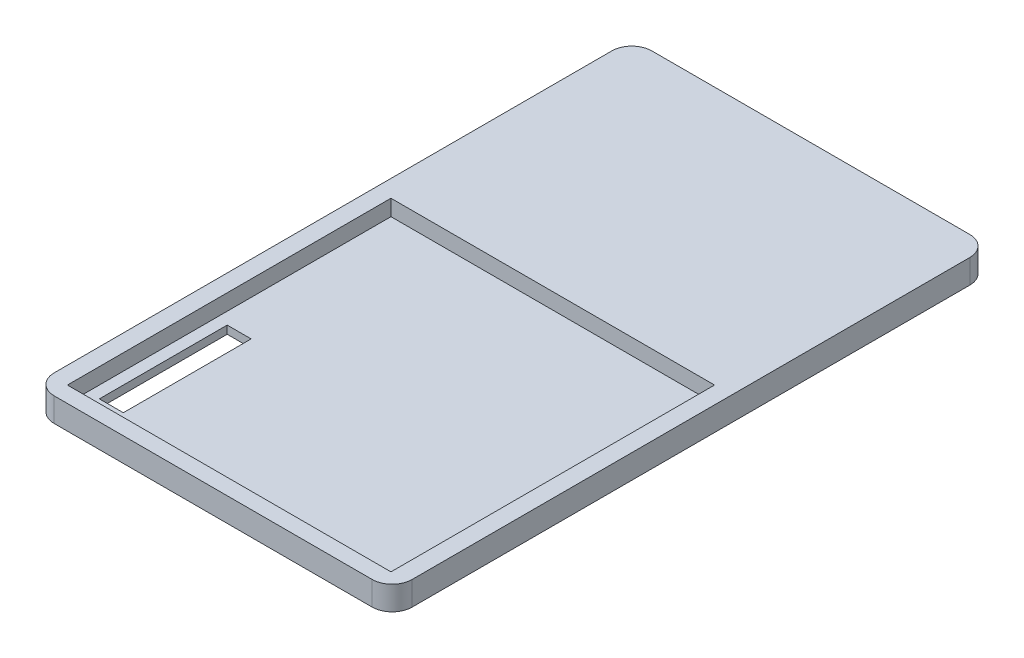
ISO-10303-21;
HEADER;
FILE_DESCRIPTION(('STEP AP214'),'2;1');
FILE_NAME('part.step','',(''),(''),'','','');
FILE_SCHEMA(('AUTOMOTIVE_DESIGN { 1 0 10303 214 1 1 1 1 }'));
ENDSEC;
DATA;
#1=APPLICATION_CONTEXT('core data for automotive mechanical design processes');
#2=APPLICATION_PROTOCOL_DEFINITION('international standard','automotive_design',2000,#1);
#3=PRODUCT_CONTEXT('',#1,'mechanical');
#4=PRODUCT('Part','Part','',(#3));
#5=PRODUCT_RELATED_PRODUCT_CATEGORY('part','',(#4));
#6=PRODUCT_DEFINITION_FORMATION('','',#4);
#7=PRODUCT_DEFINITION_CONTEXT('part definition',#1,'design');
#8=PRODUCT_DEFINITION('design','',#6,#7);
#9=PRODUCT_DEFINITION_SHAPE('','',#8);
#10=(LENGTH_UNIT() NAMED_UNIT(*) SI_UNIT(.MILLI.,.METRE.));
#11=(NAMED_UNIT(*) PLANE_ANGLE_UNIT() SI_UNIT($,.RADIAN.));
#12=(NAMED_UNIT(*) SI_UNIT($,.STERADIAN.) SOLID_ANGLE_UNIT());
#13=UNCERTAINTY_MEASURE_WITH_UNIT(LENGTH_MEASURE(1.E-05),#10,'distance_accuracy_value','');
#14=(GEOMETRIC_REPRESENTATION_CONTEXT(3) GLOBAL_UNCERTAINTY_ASSIGNED_CONTEXT((#13)) GLOBAL_UNIT_ASSIGNED_CONTEXT((#10,
#11,#12)) REPRESENTATION_CONTEXT('',''));
#15=CARTESIAN_POINT('',(0.,0.,0.));
#16=DIRECTION('',(0.,0.,1.));
#17=DIRECTION('',(1.,0.,0.));
#18=AXIS2_PLACEMENT_3D('',#15,#16,#17);
#19=CARTESIAN_POINT('',(0.,3.,-37.4));
#20=DIRECTION('',(0.,0.,-1.));
#21=DIRECTION('',(-1.,0.,0.));
#22=AXIS2_PLACEMENT_3D('',#19,#20,#21);
#23=PLANE('',#22);
#24=DIRECTION('',(1.,0.,0.));
#25=VECTOR('',#24,1.);
#26=CARTESIAN_POINT('',(0.,0.,-37.4));
#27=LINE('',#26,#25);
#28=CARTESIAN_POINT('',(-19.9,0.,-37.4));
#29=VERTEX_POINT('',#28);
#30=CARTESIAN_POINT('',(19.9,0.,-37.4));
#31=VERTEX_POINT('',#30);
#32=EDGE_CURVE('E164',#29,#31,#27,.T.);
#33=ORIENTED_EDGE('',*,*,#32,.F.);
#34=DIRECTION('',(0.,-1.,0.));
#35=VECTOR('',#34,1.);
#36=CARTESIAN_POINT('',(-19.9,3.,-37.4));
#37=LINE('',#36,#35);
#38=CARTESIAN_POINT('',(-19.9,3.,-37.4));
#39=VERTEX_POINT('',#38);
#40=EDGE_CURVE('E11',#39,#29,#37,.T.);
#41=ORIENTED_EDGE('',*,*,#40,.F.);
#42=DIRECTION('',(1.,0.,0.));
#43=VECTOR('',#42,1.);
#44=CARTESIAN_POINT('',(0.,3.,-37.4));
#45=LINE('',#44,#43);
#46=CARTESIAN_POINT('',(19.9,3.,-37.4));
#47=VERTEX_POINT('',#46);
#48=EDGE_CURVE('E218',#39,#47,#45,.T.);
#49=ORIENTED_EDGE('',*,*,#48,.T.);
#50=DIRECTION('',(0.,-1.,0.));
#51=VECTOR('',#50,1.);
#52=CARTESIAN_POINT('',(19.9,3.,-37.4));
#53=LINE('',#52,#51);
#54=EDGE_CURVE('E263',#47,#31,#53,.T.);
#55=ORIENTED_EDGE('',*,*,#54,.T.);
#56=EDGE_LOOP('',(#33,#41,#49,#55));
#57=FACE_BOUND('',#56,.T.);
#58=ADVANCED_FACE('F37',(#57),#23,.T.);
#59=CARTESIAN_POINT('',(-19.9,3.,-34.9));
#60=DIRECTION('',(0.,-1.,0.));
#61=DIRECTION('',(0.,0.,-1.));
#62=AXIS2_PLACEMENT_3D('',#59,#60,#61);
#63=CYLINDRICAL_SURFACE('',#62,2.5);
#64=CARTESIAN_POINT('',(-19.9,0.,-34.9));
#65=DIRECTION('',(0.,1.,0.));
#66=DIRECTION('',(0.,0.,1.));
#67=AXIS2_PLACEMENT_3D('',#64,#65,#66);
#68=CIRCLE('',#67,2.5);
#69=CARTESIAN_POINT('',(-22.4,0.,-34.9));
#70=VERTEX_POINT('',#69);
#71=EDGE_CURVE('E243',#29,#70,#68,.T.);
#72=ORIENTED_EDGE('',*,*,#71,.T.);
#73=DIRECTION('',(0.,-1.,0.));
#74=VECTOR('',#73,1.);
#75=CARTESIAN_POINT('',(-22.4,3.,-34.9));
#76=LINE('',#75,#74);
#77=CARTESIAN_POINT('',(-22.4,3.,-34.9));
#78=VERTEX_POINT('',#77);
#79=EDGE_CURVE('E46',#78,#70,#76,.T.);
#80=ORIENTED_EDGE('',*,*,#79,.F.);
#81=CARTESIAN_POINT('',(-19.9,3.,-34.9));
#82=DIRECTION('',(0.,1.,0.));
#83=DIRECTION('',(0.,0.,1.));
#84=AXIS2_PLACEMENT_3D('',#81,#82,#83);
#85=CIRCLE('',#84,2.5);
#86=EDGE_CURVE('E221',#39,#78,#85,.T.);
#87=ORIENTED_EDGE('',*,*,#86,.F.);
#88=ORIENTED_EDGE('',*,*,#40,.T.);
#89=EDGE_LOOP('',(#72,#80,#87,#88));
#90=FACE_BOUND('',#89,.T.);
#91=ADVANCED_FACE('F305',(#90),#63,.T.);
#92=CARTESIAN_POINT('',(-22.4,3.,0.));
#93=DIRECTION('',(1.,0.,0.));
#94=DIRECTION('',(0.,0.,-1.));
#95=AXIS2_PLACEMENT_3D('',#92,#93,#94);
#96=PLANE('',#95);
#97=DIRECTION('',(0.,0.,1.));
#98=VECTOR('',#97,1.);
#99=CARTESIAN_POINT('',(-22.4,0.,0.));
#100=LINE('',#99,#98);
#101=CARTESIAN_POINT('',(-22.4,0.,34.9));
#102=VERTEX_POINT('',#101);
#103=EDGE_CURVE('E246',#70,#102,#100,.T.);
#104=ORIENTED_EDGE('',*,*,#103,.T.);
#105=DIRECTION('',(0.,-1.,0.));
#106=VECTOR('',#105,1.);
#107=CARTESIAN_POINT('',(-22.4,3.,34.9));
#108=LINE('',#107,#106);
#109=CARTESIAN_POINT('',(-22.4,3.,34.9));
#110=VERTEX_POINT('',#109);
#111=EDGE_CURVE('E275',#110,#102,#108,.T.);
#112=ORIENTED_EDGE('',*,*,#111,.F.);
#113=DIRECTION('',(0.,0.,1.));
#114=VECTOR('',#113,1.);
#115=CARTESIAN_POINT('',(-22.4,3.,0.));
#116=LINE('',#115,#114);
#117=EDGE_CURVE('E224',#78,#110,#116,.T.);
#118=ORIENTED_EDGE('',*,*,#117,.F.);
#119=ORIENTED_EDGE('',*,*,#79,.T.);
#120=EDGE_LOOP('',(#104,#112,#118,#119));
#121=FACE_BOUND('',#120,.T.);
#122=ADVANCED_FACE('F311',(#121),#96,.F.);
#123=CARTESIAN_POINT('',(-19.9,3.,34.9));
#124=DIRECTION('',(0.,-1.,0.));
#125=DIRECTION('',(0.,0.,-1.));
#126=AXIS2_PLACEMENT_3D('',#123,#124,#125);
#127=CYLINDRICAL_SURFACE('',#126,2.5);
#128=CARTESIAN_POINT('',(-19.9,0.,34.9));
#129=DIRECTION('',(0.,1.,0.));
#130=DIRECTION('',(0.,0.,1.));
#131=AXIS2_PLACEMENT_3D('',#128,#129,#130);
#132=CIRCLE('',#131,2.5);
#133=CARTESIAN_POINT('',(-19.9,0.,37.4));
#134=VERTEX_POINT('',#133);
#135=EDGE_CURVE('E249',#102,#134,#132,.T.);
#136=ORIENTED_EDGE('',*,*,#135,.T.);
#137=DIRECTION('',(0.,-1.,0.));
#138=VECTOR('',#137,1.);
#139=CARTESIAN_POINT('',(-19.9,3.,37.4));
#140=LINE('',#139,#138);
#141=CARTESIAN_POINT('',(-19.9,3.,37.4));
#142=VERTEX_POINT('',#141);
#143=EDGE_CURVE('E272',#142,#134,#140,.T.);
#144=ORIENTED_EDGE('',*,*,#143,.F.);
#145=CARTESIAN_POINT('',(-19.9,3.,34.9));
#146=DIRECTION('',(0.,1.,0.));
#147=DIRECTION('',(0.,0.,1.));
#148=AXIS2_PLACEMENT_3D('',#145,#146,#147);
#149=CIRCLE('',#148,2.5);
#150=EDGE_CURVE('E227',#110,#142,#149,.T.);
#151=ORIENTED_EDGE('',*,*,#150,.F.);
#152=ORIENTED_EDGE('',*,*,#111,.T.);
#153=EDGE_LOOP('',(#136,#144,#151,#152));
#154=FACE_BOUND('',#153,.T.);
#155=ADVANCED_FACE('F437',(#154),#127,.T.);
#156=CARTESIAN_POINT('',(0.,3.,37.4));
#157=DIRECTION('',(0.,0.,-1.));
#158=DIRECTION('',(-1.,0.,0.));
#159=AXIS2_PLACEMENT_3D('',#156,#157,#158);
#160=PLANE('',#159);
#161=DIRECTION('',(1.,0.,0.));
#162=VECTOR('',#161,1.);
#163=CARTESIAN_POINT('',(0.,0.,37.4));
#164=LINE('',#163,#162);
#165=CARTESIAN_POINT('',(19.9,0.,37.4));
#166=VERTEX_POINT('',#165);
#167=EDGE_CURVE('E252',#134,#166,#164,.T.);
#168=ORIENTED_EDGE('',*,*,#167,.T.);
#169=DIRECTION('',(0.,-1.,0.));
#170=VECTOR('',#169,1.);
#171=CARTESIAN_POINT('',(19.9,3.,37.4));
#172=LINE('',#171,#170);
#173=CARTESIAN_POINT('',(19.9,3.,37.4));
#174=VERTEX_POINT('',#173);
#175=EDGE_CURVE('E269',#174,#166,#172,.T.);
#176=ORIENTED_EDGE('',*,*,#175,.F.);
#177=DIRECTION('',(1.,0.,0.));
#178=VECTOR('',#177,1.);
#179=CARTESIAN_POINT('',(0.,3.,37.4));
#180=LINE('',#179,#178);
#181=EDGE_CURVE('E230',#142,#174,#180,.T.);
#182=ORIENTED_EDGE('',*,*,#181,.F.);
#183=ORIENTED_EDGE('',*,*,#143,.T.);
#184=EDGE_LOOP('',(#168,#176,#182,#183));
#185=FACE_BOUND('',#184,.T.);
#186=ADVANCED_FACE('F428',(#185),#160,.F.);
#187=CARTESIAN_POINT('',(19.9,3.,34.9));
#188=DIRECTION('',(0.,-1.,0.));
#189=DIRECTION('',(0.,0.,-1.));
#190=AXIS2_PLACEMENT_3D('',#187,#188,#189);
#191=CYLINDRICAL_SURFACE('',#190,2.5);
#192=CARTESIAN_POINT('',(19.9,0.,34.9));
#193=DIRECTION('',(0.,1.,0.));
#194=DIRECTION('',(0.,0.,1.));
#195=AXIS2_PLACEMENT_3D('',#192,#193,#194);
#196=CIRCLE('',#195,2.5);
#197=CARTESIAN_POINT('',(22.4,0.,34.9));
#198=VERTEX_POINT('',#197);
#199=EDGE_CURVE('E255',#166,#198,#196,.T.);
#200=ORIENTED_EDGE('',*,*,#199,.T.);
#201=DIRECTION('',(0.,-1.,0.));
#202=VECTOR('',#201,1.);
#203=CARTESIAN_POINT('',(22.4,3.,34.9));
#204=LINE('',#203,#202);
#205=CARTESIAN_POINT('',(22.4,3.,34.9));
#206=VERTEX_POINT('',#205);
#207=EDGE_CURVE('E267',#206,#198,#204,.T.);
#208=ORIENTED_EDGE('',*,*,#207,.F.);
#209=CARTESIAN_POINT('',(19.9,3.,34.9));
#210=DIRECTION('',(0.,1.,0.));
#211=DIRECTION('',(0.,0.,1.));
#212=AXIS2_PLACEMENT_3D('',#209,#210,#211);
#213=CIRCLE('',#212,2.5);
#214=EDGE_CURVE('E233',#174,#206,#213,.T.);
#215=ORIENTED_EDGE('',*,*,#214,.F.);
#216=ORIENTED_EDGE('',*,*,#175,.T.);
#217=EDGE_LOOP('',(#200,#208,#215,#216));
#218=FACE_BOUND('',#217,.T.);
#219=ADVANCED_FACE('F301',(#218),#191,.T.);
#220=CARTESIAN_POINT('',(22.4,3.,0.));
#221=DIRECTION('',(1.,0.,0.));
#222=DIRECTION('',(0.,0.,-1.));
#223=AXIS2_PLACEMENT_3D('',#220,#221,#222);
#224=PLANE('',#223);
#225=DIRECTION('',(0.,0.,1.));
#226=VECTOR('',#225,1.);
#227=CARTESIAN_POINT('',(22.4,0.,0.));
#228=LINE('',#227,#226);
#229=CARTESIAN_POINT('',(22.4,0.,-34.9));
#230=VERTEX_POINT('',#229);
#231=EDGE_CURVE('E258',#230,#198,#228,.T.);
#232=ORIENTED_EDGE('',*,*,#231,.F.);
#233=DIRECTION('',(0.,-1.,0.));
#234=VECTOR('',#233,1.);
#235=CARTESIAN_POINT('',(22.4,3.,-34.9));
#236=LINE('',#235,#234);
#237=CARTESIAN_POINT('',(22.4,3.,-34.9));
#238=VERTEX_POINT('',#237);
#239=EDGE_CURVE('E265',#238,#230,#236,.T.);
#240=ORIENTED_EDGE('',*,*,#239,.F.);
#241=DIRECTION('',(0.,0.,1.));
#242=VECTOR('',#241,1.);
#243=CARTESIAN_POINT('',(22.4,3.,0.));
#244=LINE('',#243,#242);
#245=EDGE_CURVE('E235',#238,#206,#244,.T.);
#246=ORIENTED_EDGE('',*,*,#245,.T.);
#247=ORIENTED_EDGE('',*,*,#207,.T.);
#248=EDGE_LOOP('',(#232,#240,#246,#247));
#249=FACE_BOUND('',#248,.T.);
#250=ADVANCED_FACE('F296',(#249),#224,.T.);
#251=CARTESIAN_POINT('',(0.,3.,-5.10000000000002));
#252=DIRECTION('',(0.,0.,-1.));
#253=DIRECTION('',(-1.,0.,0.));
#254=AXIS2_PLACEMENT_3D('',#251,#252,#253);
#255=PLANE('',#254);
#256=DIRECTION('',(0.,-1.,0.));
#257=VECTOR('',#256,1.);
#258=CARTESIAN_POINT('',(-20.25,3.,-5.10000000000001));
#259=LINE('',#258,#257);
#260=CARTESIAN_POINT('',(-20.25,3.,-5.10000000000001));
#261=VERTEX_POINT('',#260);
#262=CARTESIAN_POINT('',(-20.25,1.,-5.10000000000001));
#263=VERTEX_POINT('',#262);
#264=EDGE_CURVE('E240',#261,#263,#259,.T.);
#265=ORIENTED_EDGE('',*,*,#264,.T.);
#266=DIRECTION('',(1.,0.,0.));
#267=VECTOR('',#266,1.);
#268=CARTESIAN_POINT('',(0.,1.,-5.10000000000002));
#269=LINE('',#268,#267);
#270=CARTESIAN_POINT('',(20.25,1.,-5.10000000000002));
#271=VERTEX_POINT('',#270);
#272=EDGE_CURVE('E54',#263,#271,#269,.T.);
#273=ORIENTED_EDGE('',*,*,#272,.T.);
#274=DIRECTION('',(0.,-1.,0.));
#275=VECTOR('',#274,1.);
#276=CARTESIAN_POINT('',(20.25,3.,-5.10000000000002));
#277=LINE('',#276,#275);
#278=CARTESIAN_POINT('',(20.25,3.,-5.10000000000002));
#279=VERTEX_POINT('',#278);
#280=EDGE_CURVE('E41',#279,#271,#277,.T.);
#281=ORIENTED_EDGE('',*,*,#280,.F.);
#282=DIRECTION('',(1.,0.,0.));
#283=VECTOR('',#282,1.);
#284=CARTESIAN_POINT('',(0.,3.,-5.10000000000002));
#285=LINE('',#284,#283);
#286=EDGE_CURVE('E206',#261,#279,#285,.T.);
#287=ORIENTED_EDGE('',*,*,#286,.F.);
#288=EDGE_LOOP('',(#265,#273,#281,#287));
#289=FACE_BOUND('',#288,.T.);
#290=ADVANCED_FACE('F39',(#289),#255,.F.);
#291=CARTESIAN_POINT('',(20.25,3.,0.));
#292=DIRECTION('',(1.,0.,0.));
#293=DIRECTION('',(0.,0.,-1.));
#294=AXIS2_PLACEMENT_3D('',#291,#292,#293);
#295=PLANE('',#294);
#296=ORIENTED_EDGE('',*,*,#280,.T.);
#297=DIRECTION('',(0.,0.,1.));
#298=VECTOR('',#297,1.);
#299=CARTESIAN_POINT('',(20.25,1.,0.));
#300=LINE('',#299,#298);
#301=CARTESIAN_POINT('',(20.25,1.,35.4));
#302=VERTEX_POINT('',#301);
#303=EDGE_CURVE('E61',#271,#302,#300,.T.);
#304=ORIENTED_EDGE('',*,*,#303,.T.);
#305=DIRECTION('',(0.,-1.,0.));
#306=VECTOR('',#305,1.);
#307=CARTESIAN_POINT('',(20.25,3.,35.4));
#308=LINE('',#307,#306);
#309=CARTESIAN_POINT('',(20.25,3.,35.4));
#310=VERTEX_POINT('',#309);
#311=EDGE_CURVE('E282',#310,#302,#308,.T.);
#312=ORIENTED_EDGE('',*,*,#311,.F.);
#313=DIRECTION('',(0.,0.,1.));
#314=VECTOR('',#313,1.);
#315=CARTESIAN_POINT('',(20.25,3.,0.));
#316=LINE('',#315,#314);
#317=EDGE_CURVE('E209',#279,#310,#316,.T.);
#318=ORIENTED_EDGE('',*,*,#317,.F.);
#319=EDGE_LOOP('',(#296,#304,#312,#318));
#320=FACE_BOUND('',#319,.T.);
#321=ADVANCED_FACE('F285',(#320),#295,.F.);
#322=CARTESIAN_POINT('',(0.,3.,35.4));
#323=DIRECTION('',(0.,0.,-1.));
#324=DIRECTION('',(-1.,0.,0.));
#325=AXIS2_PLACEMENT_3D('',#322,#323,#324);
#326=PLANE('',#325);
#327=DIRECTION('',(1.,0.,0.));
#328=VECTOR('',#327,1.);
#329=CARTESIAN_POINT('',(0.,1.,35.4));
#330=LINE('',#329,#328);
#331=CARTESIAN_POINT('',(-20.25,1.,35.4));
#332=VERTEX_POINT('',#331);
#333=EDGE_CURVE('E190',#332,#302,#330,.T.);
#334=ORIENTED_EDGE('',*,*,#333,.F.);
#335=DIRECTION('',(0.,-1.,0.));
#336=VECTOR('',#335,1.);
#337=CARTESIAN_POINT('',(-20.25,3.,35.4));
#338=LINE('',#337,#336);
#339=CARTESIAN_POINT('',(-20.25,3.,35.4));
#340=VERTEX_POINT('',#339);
#341=EDGE_CURVE('E281',#340,#332,#338,.T.);
#342=ORIENTED_EDGE('',*,*,#341,.F.);
#343=DIRECTION('',(1.,0.,0.));
#344=VECTOR('',#343,1.);
#345=CARTESIAN_POINT('',(0.,3.,35.4));
#346=LINE('',#345,#344);
#347=EDGE_CURVE('E212',#340,#310,#346,.T.);
#348=ORIENTED_EDGE('',*,*,#347,.T.);
#349=ORIENTED_EDGE('',*,*,#311,.T.);
#350=EDGE_LOOP('',(#334,#342,#348,#349));
#351=FACE_BOUND('',#350,.T.);
#352=ADVANCED_FACE('F287',(#351),#326,.T.);
#353=CARTESIAN_POINT('',(-20.25,3.,0.));
#354=DIRECTION('',(1.,0.,0.));
#355=DIRECTION('',(0.,0.,-1.));
#356=AXIS2_PLACEMENT_3D('',#353,#354,#355);
#357=PLANE('',#356);
#358=DIRECTION('',(0.,0.,1.));
#359=VECTOR('',#358,1.);
#360=CARTESIAN_POINT('',(-20.25,1.,0.));
#361=LINE('',#360,#359);
#362=EDGE_CURVE('E187',#263,#332,#361,.T.);
#363=ORIENTED_EDGE('',*,*,#362,.F.);
#364=ORIENTED_EDGE('',*,*,#264,.F.);
#365=DIRECTION('',(0.,0.,1.));
#366=VECTOR('',#365,1.);
#367=CARTESIAN_POINT('',(-20.25,3.,0.));
#368=LINE('',#367,#366);
#369=EDGE_CURVE('E215',#261,#340,#368,.T.);
#370=ORIENTED_EDGE('',*,*,#369,.T.);
#371=ORIENTED_EDGE('',*,*,#341,.T.);
#372=EDGE_LOOP('',(#363,#364,#370,#371));
#373=FACE_BOUND('',#372,.T.);
#374=ADVANCED_FACE('F294',(#373),#357,.T.);
#375=CARTESIAN_POINT('',(19.9,3.,-34.9));
#376=DIRECTION('',(0.,-1.,0.));
#377=DIRECTION('',(0.,0.,-1.));
#378=AXIS2_PLACEMENT_3D('',#375,#376,#377);
#379=CYLINDRICAL_SURFACE('',#378,2.5);
#380=CARTESIAN_POINT('',(19.9,0.,-34.9));
#381=DIRECTION('',(0.,1.,0.));
#382=DIRECTION('',(0.,0.,1.));
#383=AXIS2_PLACEMENT_3D('',#380,#381,#382);
#384=CIRCLE('',#383,2.5);
#385=EDGE_CURVE('E210',#230,#31,#384,.T.);
#386=ORIENTED_EDGE('',*,*,#385,.T.);
#387=ORIENTED_EDGE('',*,*,#54,.F.);
#388=CARTESIAN_POINT('',(19.9,3.,-34.9));
#389=DIRECTION('',(0.,1.,0.));
#390=DIRECTION('',(0.,0.,1.));
#391=AXIS2_PLACEMENT_3D('',#388,#389,#390);
#392=CIRCLE('',#391,2.5);
#393=EDGE_CURVE('E238',#238,#47,#392,.T.);
#394=ORIENTED_EDGE('',*,*,#393,.F.);
#395=ORIENTED_EDGE('',*,*,#239,.T.);
#396=EDGE_LOOP('',(#386,#387,#394,#395));
#397=FACE_BOUND('',#396,.T.);
#398=ADVANCED_FACE('F319',(#397),#379,.T.);
#399=CARTESIAN_POINT('',(0.,3.,0.));
#400=DIRECTION('',(0.,1.,0.));
#401=DIRECTION('',(0.,0.,1.));
#402=AXIS2_PLACEMENT_3D('',#399,#400,#401);
#403=PLANE('',#402);
#404=ORIENTED_EDGE('',*,*,#286,.T.);
#405=ORIENTED_EDGE('',*,*,#317,.T.);
#406=ORIENTED_EDGE('',*,*,#347,.F.);
#407=ORIENTED_EDGE('',*,*,#369,.F.);
#408=EDGE_LOOP('',(#404,#405,#406,#407));
#409=FACE_BOUND('',#408,.T.);
#410=ORIENTED_EDGE('',*,*,#48,.F.);
#411=ORIENTED_EDGE('',*,*,#86,.T.);
#412=ORIENTED_EDGE('',*,*,#117,.T.);
#413=ORIENTED_EDGE('',*,*,#150,.T.);
#414=ORIENTED_EDGE('',*,*,#181,.T.);
#415=ORIENTED_EDGE('',*,*,#214,.T.);
#416=ORIENTED_EDGE('',*,*,#245,.F.);
#417=ORIENTED_EDGE('',*,*,#393,.T.);
#418=EDGE_LOOP('',(#410,#411,#412,#413,#414,#415,#416,#417));
#419=FACE_BOUND('',#418,.T.);
#420=ADVANCED_FACE('F292',(#409,#419),#403,.T.);
#421=CARTESIAN_POINT('',(0.,0.,0.));
#422=DIRECTION('',(0.,1.,0.));
#423=DIRECTION('',(0.,0.,1.));
#424=AXIS2_PLACEMENT_3D('',#421,#422,#423);
#425=PLANE('',#424);
#426=ORIENTED_EDGE('',*,*,#32,.T.);
#427=ORIENTED_EDGE('',*,*,#385,.F.);
#428=ORIENTED_EDGE('',*,*,#231,.T.);
#429=ORIENTED_EDGE('',*,*,#199,.F.);
#430=ORIENTED_EDGE('',*,*,#167,.F.);
#431=ORIENTED_EDGE('',*,*,#135,.F.);
#432=ORIENTED_EDGE('',*,*,#103,.F.);
#433=ORIENTED_EDGE('',*,*,#71,.F.);
#434=EDGE_LOOP('',(#426,#427,#428,#429,#430,#431,#432,#433));
#435=FACE_BOUND('',#434,.T.);
#436=DIRECTION('',(1.,0.,0.));
#437=VECTOR('',#436,1.);
#438=CARTESIAN_POINT('',(0.,0.,32.9));
#439=LINE('',#438,#437);
#440=CARTESIAN_POINT('',(-18.75,0.,32.9));
#441=VERTEX_POINT('',#440);
#442=CARTESIAN_POINT('',(-15.75,0.,32.9));
#443=VERTEX_POINT('',#442);
#444=EDGE_CURVE('E159',#441,#443,#439,.T.);
#445=ORIENTED_EDGE('',*,*,#444,.T.);
#446=DIRECTION('',(0.,0.,1.));
#447=VECTOR('',#446,1.);
#448=CARTESIAN_POINT('',(-15.75,0.,0.));
#449=LINE('',#448,#447);
#450=CARTESIAN_POINT('',(-15.75,0.,16.9));
#451=VERTEX_POINT('',#450);
#452=EDGE_CURVE('E177',#451,#443,#449,.T.);
#453=ORIENTED_EDGE('',*,*,#452,.F.);
#454=DIRECTION('',(-1.,0.,0.));
#455=VECTOR('',#454,1.);
#456=CARTESIAN_POINT('',(0.,0.,16.9));
#457=LINE('',#456,#455);
#458=CARTESIAN_POINT('',(-18.75,0.,16.9));
#459=VERTEX_POINT('',#458);
#460=EDGE_CURVE('E197',#451,#459,#457,.T.);
#461=ORIENTED_EDGE('',*,*,#460,.T.);
#462=DIRECTION('',(0.,0.,1.));
#463=VECTOR('',#462,1.);
#464=CARTESIAN_POINT('',(-18.75,0.,0.));
#465=LINE('',#464,#463);
#466=EDGE_CURVE('E195',#459,#441,#465,.T.);
#467=ORIENTED_EDGE('',*,*,#466,.T.);
#468=EDGE_LOOP('',(#445,#453,#461,#467));
#469=FACE_BOUND('',#468,.T.);
#470=ADVANCED_FACE('F344',(#435,#469),#425,.F.);
#471=CARTESIAN_POINT('',(0.,1.,32.9));
#472=DIRECTION('',(0.,0.,-1.));
#473=DIRECTION('',(-1.,0.,0.));
#474=AXIS2_PLACEMENT_3D('',#471,#472,#473);
#475=PLANE('',#474);
#476=ORIENTED_EDGE('',*,*,#444,.F.);
#477=DIRECTION('',(0.,-1.,0.));
#478=VECTOR('',#477,1.);
#479=CARTESIAN_POINT('',(-18.75,1.,32.9));
#480=LINE('',#479,#478);
#481=CARTESIAN_POINT('',(-18.75,1.,32.9));
#482=VERTEX_POINT('',#481);
#483=EDGE_CURVE('E154',#482,#441,#480,.T.);
#484=ORIENTED_EDGE('',*,*,#483,.F.);
#485=DIRECTION('',(1.,0.,0.));
#486=VECTOR('',#485,1.);
#487=CARTESIAN_POINT('',(0.,1.,32.9));
#488=LINE('',#487,#486);
#489=CARTESIAN_POINT('',(-15.75,1.,32.9));
#490=VERTEX_POINT('',#489);
#491=EDGE_CURVE('E157',#482,#490,#488,.T.);
#492=ORIENTED_EDGE('',*,*,#491,.T.);
#493=DIRECTION('',(0.,-1.,0.));
#494=VECTOR('',#493,1.);
#495=CARTESIAN_POINT('',(-15.75,1.,32.9));
#496=LINE('',#495,#494);
#497=EDGE_CURVE('E193',#490,#443,#496,.T.);
#498=ORIENTED_EDGE('',*,*,#497,.T.);
#499=EDGE_LOOP('',(#476,#484,#492,#498));
#500=FACE_BOUND('',#499,.T.);
#501=ADVANCED_FACE('F156',(#500),#475,.T.);
#502=CARTESIAN_POINT('',(-18.75,1.,0.));
#503=DIRECTION('',(1.,0.,0.));
#504=DIRECTION('',(0.,0.,-1.));
#505=AXIS2_PLACEMENT_3D('',#502,#503,#504);
#506=PLANE('',#505);
#507=ORIENTED_EDGE('',*,*,#466,.F.);
#508=DIRECTION('',(0.,-1.,0.));
#509=VECTOR('',#508,1.);
#510=CARTESIAN_POINT('',(-18.75,1.,16.9));
#511=LINE('',#510,#509);
#512=CARTESIAN_POINT('',(-18.75,1.,16.9));
#513=VERTEX_POINT('',#512);
#514=EDGE_CURVE('E165',#513,#459,#511,.T.);
#515=ORIENTED_EDGE('',*,*,#514,.F.);
#516=DIRECTION('',(0.,0.,1.));
#517=VECTOR('',#516,1.);
#518=CARTESIAN_POINT('',(-18.75,1.,0.));
#519=LINE('',#518,#517);
#520=EDGE_CURVE('E172',#513,#482,#519,.T.);
#521=ORIENTED_EDGE('',*,*,#520,.T.);
#522=ORIENTED_EDGE('',*,*,#483,.T.);
#523=EDGE_LOOP('',(#507,#515,#521,#522));
#524=FACE_BOUND('',#523,.T.);
#525=ADVANCED_FACE('F179',(#524),#506,.T.);
#526=CARTESIAN_POINT('',(0.,1.,16.9));
#527=DIRECTION('',(0.,0.,1.));
#528=DIRECTION('',(1.,0.,0.));
#529=AXIS2_PLACEMENT_3D('',#526,#527,#528);
#530=PLANE('',#529);
#531=ORIENTED_EDGE('',*,*,#460,.F.);
#532=DIRECTION('',(0.,-1.,0.));
#533=VECTOR('',#532,1.);
#534=CARTESIAN_POINT('',(-15.75,1.,16.9));
#535=LINE('',#534,#533);
#536=CARTESIAN_POINT('',(-15.75,1.,16.9));
#537=VERTEX_POINT('',#536);
#538=EDGE_CURVE('E203',#537,#451,#535,.T.);
#539=ORIENTED_EDGE('',*,*,#538,.F.);
#540=DIRECTION('',(-1.,0.,0.));
#541=VECTOR('',#540,1.);
#542=CARTESIAN_POINT('',(0.,1.,16.9));
#543=LINE('',#542,#541);
#544=EDGE_CURVE('E180',#537,#513,#543,.T.);
#545=ORIENTED_EDGE('',*,*,#544,.T.);
#546=ORIENTED_EDGE('',*,*,#514,.T.);
#547=EDGE_LOOP('',(#531,#539,#545,#546));
#548=FACE_BOUND('',#547,.T.);
#549=ADVANCED_FACE('F363',(#548),#530,.T.);
#550=CARTESIAN_POINT('',(-15.75,1.,0.));
#551=DIRECTION('',(1.,0.,0.));
#552=DIRECTION('',(0.,0.,-1.));
#553=AXIS2_PLACEMENT_3D('',#550,#551,#552);
#554=PLANE('',#553);
#555=ORIENTED_EDGE('',*,*,#452,.T.);
#556=ORIENTED_EDGE('',*,*,#497,.F.);
#557=DIRECTION('',(0.,0.,1.));
#558=VECTOR('',#557,1.);
#559=CARTESIAN_POINT('',(-15.75,1.,0.));
#560=LINE('',#559,#558);
#561=EDGE_CURVE('E175',#537,#490,#560,.T.);
#562=ORIENTED_EDGE('',*,*,#561,.F.);
#563=ORIENTED_EDGE('',*,*,#538,.T.);
#564=EDGE_LOOP('',(#555,#556,#562,#563));
#565=FACE_BOUND('',#564,.T.);
#566=ADVANCED_FACE('F370',(#565),#554,.F.);
#567=CARTESIAN_POINT('',(0.,1.,0.));
#568=DIRECTION('',(0.,1.,0.));
#569=DIRECTION('',(0.,0.,1.));
#570=AXIS2_PLACEMENT_3D('',#567,#568,#569);
#571=PLANE('',#570);
#572=ORIENTED_EDGE('',*,*,#491,.F.);
#573=ORIENTED_EDGE('',*,*,#520,.F.);
#574=ORIENTED_EDGE('',*,*,#544,.F.);
#575=ORIENTED_EDGE('',*,*,#561,.T.);
#576=EDGE_LOOP('',(#572,#573,#574,#575));
#577=FACE_BOUND('',#576,.T.);
#578=ORIENTED_EDGE('',*,*,#303,.F.);
#579=ORIENTED_EDGE('',*,*,#272,.F.);
#580=ORIENTED_EDGE('',*,*,#362,.T.);
#581=ORIENTED_EDGE('',*,*,#333,.T.);
#582=EDGE_LOOP('',(#578,#579,#580,#581));
#583=FACE_BOUND('',#582,.T.);
#584=ADVANCED_FACE('F169',(#577,#583),#571,.T.);
#585=CLOSED_SHELL('',(#58,#91,#122,#155,#186,#219,#250,#290,#321,#352,#374,#398,#420,#470,#501,
#525,#549,#566,#584));
#586=MANIFOLD_SOLID_BREP('B2',#585);
#587=ADVANCED_BREP_SHAPE_REPRESENTATION('',(#18,#586),#14);
#588=SHAPE_DEFINITION_REPRESENTATION(#9,#587);
ENDSEC;
END-ISO-10303-21;
